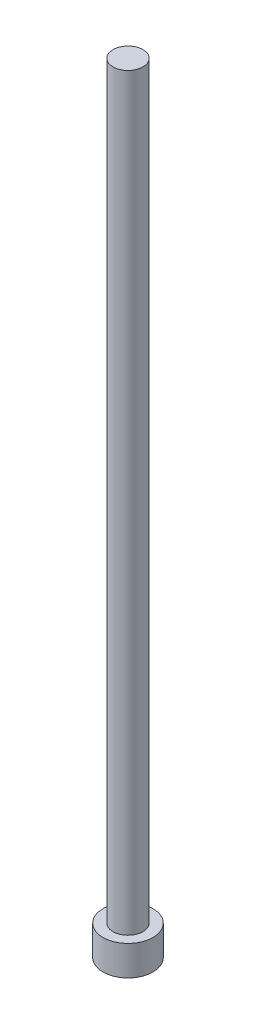
ISO-10303-21;
HEADER;
FILE_DESCRIPTION(('STEP AP214'),'2;1');
FILE_NAME('part.step','',(''),(''),'','','');
FILE_SCHEMA(('AUTOMOTIVE_DESIGN { 1 0 10303 214 1 1 1 1 }'));
ENDSEC;
DATA;
#1=APPLICATION_CONTEXT('core data for automotive mechanical design processes');
#2=APPLICATION_PROTOCOL_DEFINITION('international standard','automotive_design',2000,#1);
#3=PRODUCT_CONTEXT('',#1,'mechanical');
#4=PRODUCT('Part','Part','',(#3));
#5=PRODUCT_RELATED_PRODUCT_CATEGORY('part','',(#4));
#6=PRODUCT_DEFINITION_FORMATION('','',#4);
#7=PRODUCT_DEFINITION_CONTEXT('part definition',#1,'design');
#8=PRODUCT_DEFINITION('design','',#6,#7);
#9=PRODUCT_DEFINITION_SHAPE('','',#8);
#10=(LENGTH_UNIT() NAMED_UNIT(*) SI_UNIT(.MILLI.,.METRE.));
#11=(NAMED_UNIT(*) PLANE_ANGLE_UNIT() SI_UNIT($,.RADIAN.));
#12=(NAMED_UNIT(*) SI_UNIT($,.STERADIAN.) SOLID_ANGLE_UNIT());
#13=UNCERTAINTY_MEASURE_WITH_UNIT(LENGTH_MEASURE(1.E-05),#10,'distance_accuracy_value','');
#14=(GEOMETRIC_REPRESENTATION_CONTEXT(3) GLOBAL_UNCERTAINTY_ASSIGNED_CONTEXT((#13)) GLOBAL_UNIT_ASSIGNED_CONTEXT((#10,
#11,#12)) REPRESENTATION_CONTEXT('',''));
#15=CARTESIAN_POINT('',(0.,0.,0.));
#16=DIRECTION('',(0.,0.,1.));
#17=DIRECTION('',(1.,0.,0.));
#18=AXIS2_PLACEMENT_3D('',#15,#16,#17);
#19=CARTESIAN_POINT('',(0.,3.,0.));
#20=DIRECTION('',(0.,-1.,0.));
#21=DIRECTION('',(0.,0.,-1.));
#22=AXIS2_PLACEMENT_3D('',#19,#20,#21);
#23=CYLINDRICAL_SURFACE('',#22,2.5);
#24=CARTESIAN_POINT('',(0.,3.,0.));
#25=DIRECTION('',(0.,1.,0.));
#26=DIRECTION('',(0.,0.,1.));
#27=AXIS2_PLACEMENT_3D('',#24,#25,#26);
#28=CIRCLE('',#27,2.5);
#29=CARTESIAN_POINT('',(0.,3.,2.5));
#30=VERTEX_POINT('',#29);
#31=EDGE_CURVE('E46',#30,#30,#28,.T.);
#32=ORIENTED_EDGE('',*,*,#31,.F.);
#33=EDGE_LOOP('',(#32));
#34=FACE_BOUND('',#33,.T.);
#35=CARTESIAN_POINT('',(0.,0.,0.));
#36=DIRECTION('',(0.,1.,0.));
#37=DIRECTION('',(0.,0.,1.));
#38=AXIS2_PLACEMENT_3D('',#35,#36,#37);
#39=CIRCLE('',#38,2.5);
#40=CARTESIAN_POINT('',(0.,0.,2.5));
#41=VERTEX_POINT('',#40);
#42=EDGE_CURVE('E45',#41,#41,#39,.T.);
#43=ORIENTED_EDGE('',*,*,#42,.T.);
#44=EDGE_LOOP('',(#43));
#45=FACE_BOUND('',#44,.T.);
#46=ADVANCED_FACE('F39',(#34,#45),#23,.T.);
#47=CARTESIAN_POINT('',(0.,3.,0.));
#48=DIRECTION('',(0.,1.,0.));
#49=DIRECTION('',(0.,0.,1.));
#50=AXIS2_PLACEMENT_3D('',#47,#48,#49);
#51=PLANE('',#50);
#52=CARTESIAN_POINT('',(0.,3.,0.));
#53=DIRECTION('',(0.,1.,0.));
#54=DIRECTION('',(0.,0.,1.));
#55=AXIS2_PLACEMENT_3D('',#52,#53,#54);
#56=CIRCLE('',#55,1.5);
#57=CARTESIAN_POINT('',(0.,3.,1.5));
#58=VERTEX_POINT('',#57);
#59=EDGE_CURVE('E10',#58,#58,#56,.T.);
#60=ORIENTED_EDGE('',*,*,#59,.F.);
#61=EDGE_LOOP('',(#60));
#62=FACE_BOUND('',#61,.T.);
#63=ORIENTED_EDGE('',*,*,#31,.T.);
#64=EDGE_LOOP('',(#63));
#65=FACE_BOUND('',#64,.T.);
#66=ADVANCED_FACE('F64',(#62,#65),#51,.T.);
#67=CARTESIAN_POINT('',(0.,0.,0.));
#68=DIRECTION('',(0.,1.,0.));
#69=DIRECTION('',(0.,0.,1.));
#70=AXIS2_PLACEMENT_3D('',#67,#68,#69);
#71=PLANE('',#70);
#72=ORIENTED_EDGE('',*,*,#42,.F.);
#73=EDGE_LOOP('',(#72));
#74=FACE_BOUND('',#73,.T.);
#75=ADVANCED_FACE('F58',(#74),#71,.F.);
#76=CARTESIAN_POINT('',(0.,78.,0.));
#77=DIRECTION('',(0.,-1.,0.));
#78=DIRECTION('',(0.,0.,-1.));
#79=AXIS2_PLACEMENT_3D('',#76,#77,#78);
#80=CYLINDRICAL_SURFACE('',#79,1.5);
#81=CARTESIAN_POINT('',(0.,78.,0.));
#82=DIRECTION('',(0.,1.,0.));
#83=DIRECTION('',(0.,0.,1.));
#84=AXIS2_PLACEMENT_3D('',#81,#82,#83);
#85=CIRCLE('',#84,1.5);
#86=CARTESIAN_POINT('',(0.,78.,1.5));
#87=VERTEX_POINT('',#86);
#88=EDGE_CURVE('E55',#87,#87,#85,.T.);
#89=ORIENTED_EDGE('',*,*,#88,.F.);
#90=EDGE_LOOP('',(#89));
#91=FACE_BOUND('',#90,.T.);
#92=ORIENTED_EDGE('',*,*,#59,.T.);
#93=EDGE_LOOP('',(#92));
#94=FACE_BOUND('',#93,.T.);
#95=ADVANCED_FACE('F65',(#91,#94),#80,.T.);
#96=CARTESIAN_POINT('',(0.,78.,0.));
#97=DIRECTION('',(0.,1.,0.));
#98=DIRECTION('',(0.,0.,1.));
#99=AXIS2_PLACEMENT_3D('',#96,#97,#98);
#100=PLANE('',#99);
#101=ORIENTED_EDGE('',*,*,#88,.T.);
#102=EDGE_LOOP('',(#101));
#103=FACE_BOUND('',#102,.T.);
#104=ADVANCED_FACE('F67',(#103),#100,.T.);
#105=CLOSED_SHELL('',(#46,#66,#75,#95,#104));
#106=MANIFOLD_SOLID_BREP('B2',#105);
#107=ADVANCED_BREP_SHAPE_REPRESENTATION('',(#18,#106),#14);
#108=SHAPE_DEFINITION_REPRESENTATION(#9,#107);
ENDSEC;
END-ISO-10303-21;
